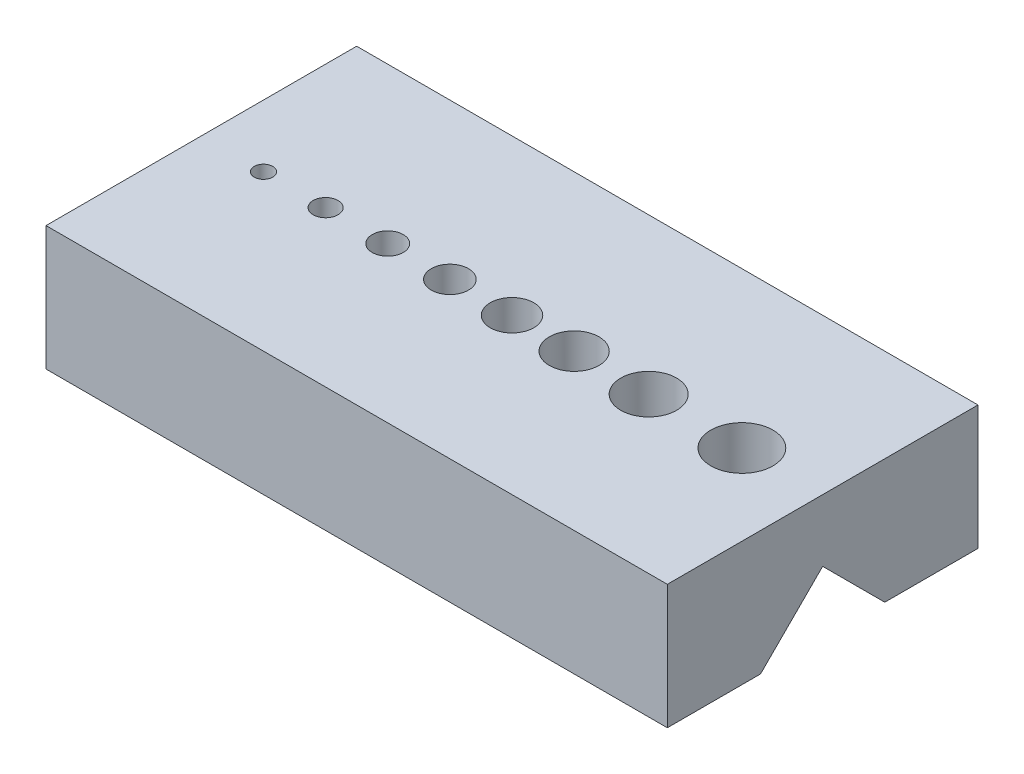
ISO-10303-21;
HEADER;
FILE_DESCRIPTION(('STEP AP214'),'2;1');
FILE_NAME('part.step','',(''),(''),'','','');
FILE_SCHEMA(('AUTOMOTIVE_DESIGN { 1 0 10303 214 1 1 1 1 }'));
ENDSEC;
DATA;
#1=APPLICATION_CONTEXT('core data for automotive mechanical design processes');
#2=APPLICATION_PROTOCOL_DEFINITION('international standard','automotive_design',2000,#1);
#3=PRODUCT_CONTEXT('',#1,'mechanical');
#4=PRODUCT('Part','Part','',(#3));
#5=PRODUCT_RELATED_PRODUCT_CATEGORY('part','',(#4));
#6=PRODUCT_DEFINITION_FORMATION('','',#4);
#7=PRODUCT_DEFINITION_CONTEXT('part definition',#1,'design');
#8=PRODUCT_DEFINITION('design','',#6,#7);
#9=PRODUCT_DEFINITION_SHAPE('','',#8);
#10=(LENGTH_UNIT() NAMED_UNIT(*) SI_UNIT(.MILLI.,.METRE.));
#11=(NAMED_UNIT(*) PLANE_ANGLE_UNIT() SI_UNIT($,.RADIAN.));
#12=(NAMED_UNIT(*) SI_UNIT($,.STERADIAN.) SOLID_ANGLE_UNIT());
#13=UNCERTAINTY_MEASURE_WITH_UNIT(LENGTH_MEASURE(1.E-05),#10,'distance_accuracy_value','');
#14=(GEOMETRIC_REPRESENTATION_CONTEXT(3) GLOBAL_UNCERTAINTY_ASSIGNED_CONTEXT((#13)) GLOBAL_UNIT_ASSIGNED_CONTEXT((#10,
#11,#12)) REPRESENTATION_CONTEXT('',''));
#15=CARTESIAN_POINT('',(0.,0.,0.));
#16=DIRECTION('',(0.,0.,1.));
#17=DIRECTION('',(1.,0.,0.));
#18=AXIS2_PLACEMENT_3D('',#15,#16,#17);
#19=CARTESIAN_POINT('',(0.,0.,0.));
#20=DIRECTION('',(0.,-1.,0.));
#21=DIRECTION('',(0.,0.,-1.));
#22=AXIS2_PLACEMENT_3D('',#19,#20,#21);
#23=PLANE('',#22);
#24=DIRECTION('',(1.,0.,0.));
#25=VECTOR('',#24,1.);
#26=CARTESIAN_POINT('',(0.,0.,-15.));
#27=LINE('',#26,#25);
#28=CARTESIAN_POINT('',(0.,0.,-15.));
#29=VERTEX_POINT('',#28);
#30=CARTESIAN_POINT('',(100.,0.,-15.));
#31=VERTEX_POINT('',#30);
#32=EDGE_CURVE('E304',#29,#31,#27,.T.);
#33=ORIENTED_EDGE('',*,*,#32,.T.);
#34=DIRECTION('',(0.,0.,-1.));
#35=VECTOR('',#34,1.);
#36=CARTESIAN_POINT('',(100.,0.,0.));
#37=LINE('',#36,#35);
#38=CARTESIAN_POINT('',(100.,0.,0.));
#39=VERTEX_POINT('',#38);
#40=EDGE_CURVE('E189',#39,#31,#37,.T.);
#41=ORIENTED_EDGE('',*,*,#40,.F.);
#42=DIRECTION('',(1.,0.,0.));
#43=VECTOR('',#42,1.);
#44=CARTESIAN_POINT('',(0.,0.,0.));
#45=LINE('',#44,#43);
#46=CARTESIAN_POINT('',(0.,0.,0.));
#47=VERTEX_POINT('',#46);
#48=EDGE_CURVE('E178',#47,#39,#45,.T.);
#49=ORIENTED_EDGE('',*,*,#48,.F.);
#50=DIRECTION('',(0.,0.,1.));
#51=VECTOR('',#50,1.);
#52=CARTESIAN_POINT('',(0.,0.,0.));
#53=LINE('',#52,#51);
#54=EDGE_CURVE('E179',#29,#47,#53,.T.);
#55=ORIENTED_EDGE('',*,*,#54,.F.);
#56=EDGE_LOOP('',(#33,#41,#49,#55));
#57=FACE_BOUND('',#56,.T.);
#58=ADVANCED_FACE('F45',(#57),#23,.T.);
#59=CARTESIAN_POINT('',(0.,20.,0.));
#60=DIRECTION('',(0.,-1.,0.));
#61=DIRECTION('',(0.,0.,-1.));
#62=AXIS2_PLACEMENT_3D('',#59,#60,#61);
#63=PLANE('',#62);
#64=DIRECTION('',(0.,0.,1.));
#65=VECTOR('',#64,1.);
#66=CARTESIAN_POINT('',(0.,20.,0.));
#67=LINE('',#66,#65);
#68=CARTESIAN_POINT('',(0.,20.,-50.));
#69=VERTEX_POINT('',#68);
#70=CARTESIAN_POINT('',(0.,20.,0.));
#71=VERTEX_POINT('',#70);
#72=EDGE_CURVE('E196',#69,#71,#67,.T.);
#73=ORIENTED_EDGE('',*,*,#72,.T.);
#74=DIRECTION('',(1.,0.,0.));
#75=VECTOR('',#74,1.);
#76=CARTESIAN_POINT('',(0.,20.,0.));
#77=LINE('',#76,#75);
#78=CARTESIAN_POINT('',(100.,20.,0.));
#79=VERTEX_POINT('',#78);
#80=EDGE_CURVE('E273',#71,#79,#77,.T.);
#81=ORIENTED_EDGE('',*,*,#80,.T.);
#82=DIRECTION('',(0.,0.,-1.));
#83=VECTOR('',#82,1.);
#84=CARTESIAN_POINT('',(100.,20.,0.));
#85=LINE('',#84,#83);
#86=CARTESIAN_POINT('',(100.,20.,-50.));
#87=VERTEX_POINT('',#86);
#88=EDGE_CURVE('E275',#79,#87,#85,.T.);
#89=ORIENTED_EDGE('',*,*,#88,.T.);
#90=DIRECTION('',(-1.,0.,0.));
#91=VECTOR('',#90,1.);
#92=CARTESIAN_POINT('',(0.,20.,-50.));
#93=LINE('',#92,#91);
#94=EDGE_CURVE('E186',#87,#69,#93,.T.);
#95=ORIENTED_EDGE('',*,*,#94,.T.);
#96=EDGE_LOOP('',(#73,#81,#89,#95));
#97=FACE_BOUND('',#96,.T.);
#98=CARTESIAN_POINT('',(10.,20.,-25.));
#99=DIRECTION('',(0.,1.,0.));
#100=DIRECTION('',(0.,0.,1.));
#101=AXIS2_PLACEMENT_3D('',#98,#99,#100);
#102=CIRCLE('',#101,1.5);
#103=CARTESIAN_POINT('',(10.,20.,-23.5));
#104=VERTEX_POINT('',#103);
#105=EDGE_CURVE('E184',#104,#104,#102,.T.);
#106=ORIENTED_EDGE('',*,*,#105,.F.);
#107=EDGE_LOOP('',(#106));
#108=FACE_BOUND('',#107,.T.);
#109=CARTESIAN_POINT('',(20.,20.,-25.));
#110=DIRECTION('',(0.,1.,0.));
#111=DIRECTION('',(0.,0.,1.));
#112=AXIS2_PLACEMENT_3D('',#109,#110,#111);
#113=CIRCLE('',#112,2.00000000000001);
#114=CARTESIAN_POINT('',(20.,20.,-23.));
#115=VERTEX_POINT('',#114);
#116=EDGE_CURVE('E263',#115,#115,#113,.T.);
#117=ORIENTED_EDGE('',*,*,#116,.F.);
#118=EDGE_LOOP('',(#117));
#119=FACE_BOUND('',#118,.T.);
#120=CARTESIAN_POINT('',(30.,20.,-25.));
#121=DIRECTION('',(0.,1.,0.));
#122=DIRECTION('',(0.,0.,1.));
#123=AXIS2_PLACEMENT_3D('',#120,#121,#122);
#124=CIRCLE('',#123,2.49999999999999);
#125=CARTESIAN_POINT('',(30.,20.,-22.5));
#126=VERTEX_POINT('',#125);
#127=EDGE_CURVE('E259',#126,#126,#124,.T.);
#128=ORIENTED_EDGE('',*,*,#127,.F.);
#129=EDGE_LOOP('',(#128));
#130=FACE_BOUND('',#129,.T.);
#131=CARTESIAN_POINT('',(40.,20.,-25.));
#132=DIRECTION('',(0.,1.,0.));
#133=DIRECTION('',(0.,0.,1.));
#134=AXIS2_PLACEMENT_3D('',#131,#132,#133);
#135=CIRCLE('',#134,3.);
#136=CARTESIAN_POINT('',(40.,20.,-22.));
#137=VERTEX_POINT('',#136);
#138=EDGE_CURVE('E255',#137,#137,#135,.T.);
#139=ORIENTED_EDGE('',*,*,#138,.F.);
#140=EDGE_LOOP('',(#139));
#141=FACE_BOUND('',#140,.T.);
#142=CARTESIAN_POINT('',(50.,20.,-25.));
#143=DIRECTION('',(0.,1.,0.));
#144=DIRECTION('',(0.,0.,1.));
#145=AXIS2_PLACEMENT_3D('',#142,#143,#144);
#146=CIRCLE('',#145,3.5);
#147=CARTESIAN_POINT('',(50.,20.,-21.5));
#148=VERTEX_POINT('',#147);
#149=EDGE_CURVE('E251',#148,#148,#146,.T.);
#150=ORIENTED_EDGE('',*,*,#149,.F.);
#151=EDGE_LOOP('',(#150));
#152=FACE_BOUND('',#151,.T.);
#153=CARTESIAN_POINT('',(60.,20.,-25.));
#154=DIRECTION('',(0.,1.,0.));
#155=DIRECTION('',(0.,0.,1.));
#156=AXIS2_PLACEMENT_3D('',#153,#154,#155);
#157=CIRCLE('',#156,4.00000000000001);
#158=CARTESIAN_POINT('',(60.,20.,-21.));
#159=VERTEX_POINT('',#158);
#160=EDGE_CURVE('E242',#159,#159,#157,.T.);
#161=ORIENTED_EDGE('',*,*,#160,.F.);
#162=EDGE_LOOP('',(#161));
#163=FACE_BOUND('',#162,.T.);
#164=CARTESIAN_POINT('',(72.,20.,-25.));
#165=DIRECTION('',(0.,1.,0.));
#166=DIRECTION('',(0.,0.,1.));
#167=AXIS2_PLACEMENT_3D('',#164,#165,#166);
#168=CIRCLE('',#167,4.5);
#169=CARTESIAN_POINT('',(72.,20.,-20.5));
#170=VERTEX_POINT('',#169);
#171=EDGE_CURVE('E236',#170,#170,#168,.T.);
#172=ORIENTED_EDGE('',*,*,#171,.F.);
#173=EDGE_LOOP('',(#172));
#174=FACE_BOUND('',#173,.T.);
#175=CARTESIAN_POINT('',(87.,20.,-25.));
#176=DIRECTION('',(0.,1.,0.));
#177=DIRECTION('',(0.,0.,1.));
#178=AXIS2_PLACEMENT_3D('',#175,#176,#177);
#179=CIRCLE('',#178,5.);
#180=CARTESIAN_POINT('',(87.,20.,-20.));
#181=VERTEX_POINT('',#180);
#182=EDGE_CURVE('E233',#181,#181,#179,.T.);
#183=ORIENTED_EDGE('',*,*,#182,.F.);
#184=EDGE_LOOP('',(#183));
#185=FACE_BOUND('',#184,.T.);
#186=ADVANCED_FACE('F282',(#97,#108,#119,#130,#141,#152,#163,#174,#185),#63,.F.);
#187=DIRECTION('',(1.,0.,0.));
#188=VECTOR('',#187,1.);
#189=CARTESIAN_POINT('',(0.,0.,-35.));
#190=LINE('',#189,#188);
#191=CARTESIAN_POINT('',(0.,0.,-35.));
#192=VERTEX_POINT('',#191);
#193=CARTESIAN_POINT('',(100.,0.,-35.));
#194=VERTEX_POINT('',#193);
#195=EDGE_CURVE('E61',#192,#194,#190,.T.);
#196=ORIENTED_EDGE('',*,*,#195,.F.);
#197=CARTESIAN_POINT('',(0.,0.,-50.));
#198=VERTEX_POINT('',#197);
#199=EDGE_CURVE('E168',#198,#192,#53,.T.);
#200=ORIENTED_EDGE('',*,*,#199,.F.);
#201=DIRECTION('',(-1.,0.,0.));
#202=VECTOR('',#201,1.);
#203=CARTESIAN_POINT('',(0.,0.,-50.));
#204=LINE('',#203,#202);
#205=CARTESIAN_POINT('',(100.,0.,-50.));
#206=VERTEX_POINT('',#205);
#207=EDGE_CURVE('E193',#206,#198,#204,.T.);
#208=ORIENTED_EDGE('',*,*,#207,.F.);
#209=EDGE_CURVE('E169',#194,#206,#37,.T.);
#210=ORIENTED_EDGE('',*,*,#209,.F.);
#211=EDGE_LOOP('',(#196,#200,#208,#210));
#212=FACE_BOUND('',#211,.T.);
#213=ADVANCED_FACE('F166',(#212),#23,.T.);
#214=CARTESIAN_POINT('',(0.,20.,0.));
#215=DIRECTION('',(1.,0.,0.));
#216=DIRECTION('',(0.,0.,-1.));
#217=AXIS2_PLACEMENT_3D('',#214,#215,#216);
#218=PLANE('',#217);
#219=DIRECTION('',(0.,0.707106781186548,0.707106781186547));
#220=VECTOR('',#219,1.);
#221=CARTESIAN_POINT('',(0.,10.,-25.));
#222=LINE('',#221,#220);
#223=CARTESIAN_POINT('',(0.,10.,-25.));
#224=VERTEX_POINT('',#223);
#225=EDGE_CURVE('E151',#192,#224,#222,.T.);
#226=ORIENTED_EDGE('',*,*,#225,.T.);
#227=DIRECTION('',(0.,-0.707106781186548,0.707106781186548));
#228=VECTOR('',#227,1.);
#229=CARTESIAN_POINT('',(0.,0.,-15.));
#230=LINE('',#229,#228);
#231=EDGE_CURVE('E160',#224,#29,#230,.T.);
#232=ORIENTED_EDGE('',*,*,#231,.T.);
#233=ORIENTED_EDGE('',*,*,#54,.T.);
#234=DIRECTION('',(0.,-1.,0.));
#235=VECTOR('',#234,1.);
#236=CARTESIAN_POINT('',(0.,20.,0.));
#237=LINE('',#236,#235);
#238=EDGE_CURVE('E207',#71,#47,#237,.T.);
#239=ORIENTED_EDGE('',*,*,#238,.F.);
#240=ORIENTED_EDGE('',*,*,#72,.F.);
#241=DIRECTION('',(0.,-1.,0.));
#242=VECTOR('',#241,1.);
#243=CARTESIAN_POINT('',(0.,20.,-50.));
#244=LINE('',#243,#242);
#245=EDGE_CURVE('E176',#69,#198,#244,.T.);
#246=ORIENTED_EDGE('',*,*,#245,.T.);
#247=ORIENTED_EDGE('',*,*,#199,.T.);
#248=EDGE_LOOP('',(#226,#232,#233,#239,#240,#246,#247));
#249=FACE_BOUND('',#248,.T.);
#250=ADVANCED_FACE('F47',(#249),#218,.F.);
#251=CARTESIAN_POINT('',(0.,20.,0.));
#252=DIRECTION('',(0.,0.,-1.));
#253=DIRECTION('',(-1.,0.,0.));
#254=AXIS2_PLACEMENT_3D('',#251,#252,#253);
#255=PLANE('',#254);
#256=ORIENTED_EDGE('',*,*,#48,.T.);
#257=DIRECTION('',(0.,-1.,0.));
#258=VECTOR('',#257,1.);
#259=CARTESIAN_POINT('',(100.,20.,0.));
#260=LINE('',#259,#258);
#261=EDGE_CURVE('E203',#79,#39,#260,.T.);
#262=ORIENTED_EDGE('',*,*,#261,.F.);
#263=ORIENTED_EDGE('',*,*,#80,.F.);
#264=ORIENTED_EDGE('',*,*,#238,.T.);
#265=EDGE_LOOP('',(#256,#262,#263,#264));
#266=FACE_BOUND('',#265,.T.);
#267=ADVANCED_FACE('F290',(#266),#255,.F.);
#268=CARTESIAN_POINT('',(100.,20.,0.));
#269=DIRECTION('',(-1.,0.,0.));
#270=DIRECTION('',(0.,0.,1.));
#271=AXIS2_PLACEMENT_3D('',#268,#269,#270);
#272=PLANE('',#271);
#273=ORIENTED_EDGE('',*,*,#40,.T.);
#274=DIRECTION('',(0.,-0.707106781186548,0.707106781186548));
#275=VECTOR('',#274,1.);
#276=CARTESIAN_POINT('',(100.,0.,-15.));
#277=LINE('',#276,#275);
#278=CARTESIAN_POINT('',(100.,10.,-25.));
#279=VERTEX_POINT('',#278);
#280=EDGE_CURVE('E161',#279,#31,#277,.T.);
#281=ORIENTED_EDGE('',*,*,#280,.F.);
#282=DIRECTION('',(0.,0.707106781186548,0.707106781186547));
#283=VECTOR('',#282,1.);
#284=CARTESIAN_POINT('',(100.,10.,-25.));
#285=LINE('',#284,#283);
#286=EDGE_CURVE('E296',#194,#279,#285,.T.);
#287=ORIENTED_EDGE('',*,*,#286,.F.);
#288=ORIENTED_EDGE('',*,*,#209,.T.);
#289=DIRECTION('',(0.,-1.,0.));
#290=VECTOR('',#289,1.);
#291=CARTESIAN_POINT('',(100.,20.,-50.));
#292=LINE('',#291,#290);
#293=EDGE_CURVE('E199',#87,#206,#292,.T.);
#294=ORIENTED_EDGE('',*,*,#293,.F.);
#295=ORIENTED_EDGE('',*,*,#88,.F.);
#296=ORIENTED_EDGE('',*,*,#261,.T.);
#297=EDGE_LOOP('',(#273,#281,#287,#288,#294,#295,#296));
#298=FACE_BOUND('',#297,.T.);
#299=ADVANCED_FACE('F294',(#298),#272,.F.);
#300=CARTESIAN_POINT('',(0.,20.,-50.));
#301=DIRECTION('',(0.,0.,1.));
#302=DIRECTION('',(1.,0.,0.));
#303=AXIS2_PLACEMENT_3D('',#300,#301,#302);
#304=PLANE('',#303);
#305=ORIENTED_EDGE('',*,*,#207,.T.);
#306=ORIENTED_EDGE('',*,*,#245,.F.);
#307=ORIENTED_EDGE('',*,*,#94,.F.);
#308=ORIENTED_EDGE('',*,*,#293,.T.);
#309=EDGE_LOOP('',(#305,#306,#307,#308));
#310=FACE_BOUND('',#309,.T.);
#311=ADVANCED_FACE('F286',(#310),#304,.F.);
#312=CARTESIAN_POINT('',(10.,20.,-25.));
#313=DIRECTION('',(0.,-1.,0.));
#314=DIRECTION('',(0.,0.,-1.));
#315=AXIS2_PLACEMENT_3D('',#312,#313,#314);
#316=CYLINDRICAL_SURFACE('',#315,1.5);
#317=CARTESIAN_POINT('',(10.,9.99999999999999,-25.));
#318=DIRECTION('',(0.,0.707106781186548,0.707106781186548));
#319=DIRECTION('',(0.,-0.707106781186548,0.707106781186548));
#320=AXIS2_PLACEMENT_3D('',#317,#318,#319);
#321=ELLIPSE('',#320,2.12132034355965,1.5);
#322=CARTESIAN_POINT('',(8.5,10.,-25.));
#323=VERTEX_POINT('',#322);
#324=CARTESIAN_POINT('',(11.5,10.,-25.));
#325=VERTEX_POINT('',#324);
#326=EDGE_CURVE('E237',#323,#325,#321,.T.);
#327=ORIENTED_EDGE('',*,*,#326,.F.);
#328=CARTESIAN_POINT('',(10.,10.,-25.));
#329=DIRECTION('',(0.,0.707106781186547,-0.707106781186548));
#330=DIRECTION('',(0.,-0.707106781186548,-0.707106781186547));
#331=AXIS2_PLACEMENT_3D('',#328,#329,#330);
#332=ELLIPSE('',#331,2.12132034355965,1.5);
#333=EDGE_CURVE('E327',#325,#323,#332,.T.);
#334=ORIENTED_EDGE('',*,*,#333,.F.);
#335=EDGE_LOOP('',(#327,#334));
#336=FACE_BOUND('',#335,.T.);
#337=ORIENTED_EDGE('',*,*,#105,.T.);
#338=EDGE_LOOP('',(#337));
#339=FACE_BOUND('',#338,.T.);
#340=ADVANCED_FACE('F391',(#336,#339),#316,.F.);
#341=CARTESIAN_POINT('',(20.,20.,-25.));
#342=DIRECTION('',(0.,-1.,0.));
#343=DIRECTION('',(0.,0.,-1.));
#344=AXIS2_PLACEMENT_3D('',#341,#342,#343);
#345=CYLINDRICAL_SURFACE('',#344,2.00000000000001);
#346=CARTESIAN_POINT('',(20.,9.99999999999999,-25.));
#347=DIRECTION('',(0.,0.707106781186548,0.707106781186548));
#348=DIRECTION('',(0.,-0.707106781186548,0.707106781186548));
#349=AXIS2_PLACEMENT_3D('',#346,#347,#348);
#350=ELLIPSE('',#349,2.8284271247462,2.00000000000001);
#351=CARTESIAN_POINT('',(18.,10.,-25.));
#352=VERTEX_POINT('',#351);
#353=CARTESIAN_POINT('',(22.,10.,-25.));
#354=VERTEX_POINT('',#353);
#355=EDGE_CURVE('E244',#352,#354,#350,.T.);
#356=ORIENTED_EDGE('',*,*,#355,.F.);
#357=CARTESIAN_POINT('',(20.,10.,-25.));
#358=DIRECTION('',(0.,0.707106781186547,-0.707106781186548));
#359=DIRECTION('',(0.,-0.707106781186548,-0.707106781186547));
#360=AXIS2_PLACEMENT_3D('',#357,#358,#359);
#361=ELLIPSE('',#360,2.8284271247462,2.00000000000001);
#362=EDGE_CURVE('E324',#354,#352,#361,.T.);
#363=ORIENTED_EDGE('',*,*,#362,.F.);
#364=EDGE_LOOP('',(#356,#363));
#365=FACE_BOUND('',#364,.T.);
#366=ORIENTED_EDGE('',*,*,#116,.T.);
#367=EDGE_LOOP('',(#366));
#368=FACE_BOUND('',#367,.T.);
#369=ADVANCED_FACE('F355',(#365,#368),#345,.F.);
#370=CARTESIAN_POINT('',(30.,20.,-25.));
#371=DIRECTION('',(0.,-1.,0.));
#372=DIRECTION('',(0.,0.,-1.));
#373=AXIS2_PLACEMENT_3D('',#370,#371,#372);
#374=CYLINDRICAL_SURFACE('',#373,2.49999999999999);
#375=CARTESIAN_POINT('',(30.,9.99999999999999,-25.));
#376=DIRECTION('',(0.,0.707106781186548,0.707106781186548));
#377=DIRECTION('',(0.,-0.707106781186548,0.707106781186548));
#378=AXIS2_PLACEMENT_3D('',#375,#376,#377);
#379=ELLIPSE('',#378,3.53553390593273,2.49999999999999);
#380=CARTESIAN_POINT('',(27.5,10.,-25.));
#381=VERTEX_POINT('',#380);
#382=CARTESIAN_POINT('',(32.5,10.,-25.));
#383=VERTEX_POINT('',#382);
#384=EDGE_CURVE('E344',#381,#383,#379,.T.);
#385=ORIENTED_EDGE('',*,*,#384,.F.);
#386=CARTESIAN_POINT('',(30.,10.,-25.));
#387=DIRECTION('',(0.,0.707106781186547,-0.707106781186548));
#388=DIRECTION('',(0.,-0.707106781186548,-0.707106781186547));
#389=AXIS2_PLACEMENT_3D('',#386,#387,#388);
#390=ELLIPSE('',#389,3.53553390593273,2.49999999999999);
#391=EDGE_CURVE('E321',#383,#381,#390,.T.);
#392=ORIENTED_EDGE('',*,*,#391,.F.);
#393=EDGE_LOOP('',(#385,#392));
#394=FACE_BOUND('',#393,.T.);
#395=ORIENTED_EDGE('',*,*,#127,.T.);
#396=EDGE_LOOP('',(#395));
#397=FACE_BOUND('',#396,.T.);
#398=ADVANCED_FACE('F424',(#394,#397),#374,.F.);
#399=CARTESIAN_POINT('',(40.,20.,-25.));
#400=DIRECTION('',(0.,-1.,0.));
#401=DIRECTION('',(0.,0.,-1.));
#402=AXIS2_PLACEMENT_3D('',#399,#400,#401);
#403=CYLINDRICAL_SURFACE('',#402,3.);
#404=CARTESIAN_POINT('',(40.,9.99999999999999,-25.));
#405=DIRECTION('',(0.,0.707106781186548,0.707106781186548));
#406=DIRECTION('',(0.,-0.707106781186548,0.707106781186548));
#407=AXIS2_PLACEMENT_3D('',#404,#405,#406);
#408=ELLIPSE('',#407,4.24264068711929,3.);
#409=CARTESIAN_POINT('',(37.,10.,-25.));
#410=VERTEX_POINT('',#409);
#411=CARTESIAN_POINT('',(43.,10.,-25.));
#412=VERTEX_POINT('',#411);
#413=EDGE_CURVE('E340',#410,#412,#408,.T.);
#414=ORIENTED_EDGE('',*,*,#413,.F.);
#415=CARTESIAN_POINT('',(40.,10.,-25.));
#416=DIRECTION('',(0.,0.707106781186547,-0.707106781186548));
#417=DIRECTION('',(0.,-0.707106781186548,-0.707106781186547));
#418=AXIS2_PLACEMENT_3D('',#415,#416,#417);
#419=ELLIPSE('',#418,4.24264068711929,3.);
#420=EDGE_CURVE('E318',#412,#410,#419,.T.);
#421=ORIENTED_EDGE('',*,*,#420,.F.);
#422=EDGE_LOOP('',(#414,#421));
#423=FACE_BOUND('',#422,.T.);
#424=ORIENTED_EDGE('',*,*,#138,.T.);
#425=EDGE_LOOP('',(#424));
#426=FACE_BOUND('',#425,.T.);
#427=ADVANCED_FACE('F431',(#423,#426),#403,.F.);
#428=CARTESIAN_POINT('',(50.,20.,-25.));
#429=DIRECTION('',(0.,-1.,0.));
#430=DIRECTION('',(0.,0.,-1.));
#431=AXIS2_PLACEMENT_3D('',#428,#429,#430);
#432=CYLINDRICAL_SURFACE('',#431,3.5);
#433=CARTESIAN_POINT('',(50.,9.99999999999999,-25.));
#434=DIRECTION('',(0.,0.707106781186548,0.707106781186548));
#435=DIRECTION('',(0.,-0.707106781186548,0.707106781186548));
#436=AXIS2_PLACEMENT_3D('',#433,#434,#435);
#437=ELLIPSE('',#436,4.94974746830583,3.5);
#438=CARTESIAN_POINT('',(46.5,10.,-25.));
#439=VERTEX_POINT('',#438);
#440=CARTESIAN_POINT('',(53.5,10.,-25.));
#441=VERTEX_POINT('',#440);
#442=EDGE_CURVE('E336',#439,#441,#437,.T.);
#443=ORIENTED_EDGE('',*,*,#442,.F.);
#444=CARTESIAN_POINT('',(50.,10.,-25.));
#445=DIRECTION('',(0.,0.707106781186547,-0.707106781186548));
#446=DIRECTION('',(0.,-0.707106781186548,-0.707106781186547));
#447=AXIS2_PLACEMENT_3D('',#444,#445,#446);
#448=ELLIPSE('',#447,4.94974746830584,3.5);
#449=EDGE_CURVE('E315',#441,#439,#448,.T.);
#450=ORIENTED_EDGE('',*,*,#449,.F.);
#451=EDGE_LOOP('',(#443,#450));
#452=FACE_BOUND('',#451,.T.);
#453=ORIENTED_EDGE('',*,*,#149,.T.);
#454=EDGE_LOOP('',(#453));
#455=FACE_BOUND('',#454,.T.);
#456=ADVANCED_FACE('F440',(#452,#455),#432,.F.);
#457=CARTESIAN_POINT('',(60.,20.,-25.));
#458=DIRECTION('',(0.,-1.,0.));
#459=DIRECTION('',(0.,0.,-1.));
#460=AXIS2_PLACEMENT_3D('',#457,#458,#459);
#461=CYLINDRICAL_SURFACE('',#460,4.00000000000001);
#462=CARTESIAN_POINT('',(60.,9.99999999999999,-25.));
#463=DIRECTION('',(0.,0.707106781186548,0.707106781186548));
#464=DIRECTION('',(0.,-0.707106781186548,0.707106781186548));
#465=AXIS2_PLACEMENT_3D('',#462,#463,#464);
#466=ELLIPSE('',#465,5.6568542494924,4.00000000000001);
#467=CARTESIAN_POINT('',(56.,10.,-25.));
#468=VERTEX_POINT('',#467);
#469=CARTESIAN_POINT('',(64.,10.,-25.));
#470=VERTEX_POINT('',#469);
#471=EDGE_CURVE('E332',#468,#470,#466,.T.);
#472=ORIENTED_EDGE('',*,*,#471,.F.);
#473=CARTESIAN_POINT('',(60.,10.,-25.));
#474=DIRECTION('',(0.,0.707106781186547,-0.707106781186548));
#475=DIRECTION('',(0.,-0.707106781186548,-0.707106781186547));
#476=AXIS2_PLACEMENT_3D('',#473,#474,#475);
#477=ELLIPSE('',#476,5.6568542494924,4.00000000000001);
#478=EDGE_CURVE('E312',#470,#468,#477,.T.);
#479=ORIENTED_EDGE('',*,*,#478,.F.);
#480=EDGE_LOOP('',(#472,#479));
#481=FACE_BOUND('',#480,.T.);
#482=ORIENTED_EDGE('',*,*,#160,.T.);
#483=EDGE_LOOP('',(#482));
#484=FACE_BOUND('',#483,.T.);
#485=ADVANCED_FACE('F377',(#481,#484),#461,.F.);
#486=CARTESIAN_POINT('',(72.,20.,-25.));
#487=DIRECTION('',(0.,-1.,0.));
#488=DIRECTION('',(0.,0.,-1.));
#489=AXIS2_PLACEMENT_3D('',#486,#487,#488);
#490=CYLINDRICAL_SURFACE('',#489,4.5);
#491=CARTESIAN_POINT('',(72.,9.99999999999999,-25.));
#492=DIRECTION('',(0.,0.707106781186548,0.707106781186548));
#493=DIRECTION('',(0.,-0.707106781186548,0.707106781186548));
#494=AXIS2_PLACEMENT_3D('',#491,#492,#493);
#495=ELLIPSE('',#494,6.36396103067893,4.5);
#496=CARTESIAN_POINT('',(67.5,10.,-25.));
#497=VERTEX_POINT('',#496);
#498=CARTESIAN_POINT('',(76.5,10.,-25.));
#499=VERTEX_POINT('',#498);
#500=EDGE_CURVE('E221',#497,#499,#495,.T.);
#501=ORIENTED_EDGE('',*,*,#500,.F.);
#502=CARTESIAN_POINT('',(72.,10.,-25.));
#503=DIRECTION('',(0.,0.707106781186547,-0.707106781186548));
#504=DIRECTION('',(0.,-0.707106781186548,-0.707106781186547));
#505=AXIS2_PLACEMENT_3D('',#502,#503,#504);
#506=ELLIPSE('',#505,6.36396103067894,4.5);
#507=EDGE_CURVE('E307',#499,#497,#506,.T.);
#508=ORIENTED_EDGE('',*,*,#507,.F.);
#509=EDGE_LOOP('',(#501,#508));
#510=FACE_BOUND('',#509,.T.);
#511=ORIENTED_EDGE('',*,*,#171,.T.);
#512=EDGE_LOOP('',(#511));
#513=FACE_BOUND('',#512,.T.);
#514=ADVANCED_FACE('F229',(#510,#513),#490,.F.);
#515=CARTESIAN_POINT('',(87.,20.,-25.));
#516=DIRECTION('',(0.,-1.,0.));
#517=DIRECTION('',(0.,0.,-1.));
#518=AXIS2_PLACEMENT_3D('',#515,#516,#517);
#519=CYLINDRICAL_SURFACE('',#518,5.);
#520=CARTESIAN_POINT('',(87.,9.99999999999999,-25.));
#521=DIRECTION('',(0.,0.707106781186548,0.707106781186548));
#522=DIRECTION('',(0.,-0.707106781186548,0.707106781186548));
#523=AXIS2_PLACEMENT_3D('',#520,#521,#522);
#524=ELLIPSE('',#523,7.07106781186548,5.);
#525=CARTESIAN_POINT('',(82.,10.,-25.));
#526=VERTEX_POINT('',#525);
#527=CARTESIAN_POINT('',(92.,10.,-25.));
#528=VERTEX_POINT('',#527);
#529=EDGE_CURVE('E11',#526,#528,#524,.T.);
#530=ORIENTED_EDGE('',*,*,#529,.F.);
#531=CARTESIAN_POINT('',(87.,10.,-25.));
#532=DIRECTION('',(0.,0.707106781186547,-0.707106781186548));
#533=DIRECTION('',(0.,-0.707106781186548,-0.707106781186547));
#534=AXIS2_PLACEMENT_3D('',#531,#532,#533);
#535=ELLIPSE('',#534,7.07106781186548,5.);
#536=EDGE_CURVE('E54',#528,#526,#535,.T.);
#537=ORIENTED_EDGE('',*,*,#536,.F.);
#538=EDGE_LOOP('',(#530,#537));
#539=FACE_BOUND('',#538,.T.);
#540=ORIENTED_EDGE('',*,*,#182,.T.);
#541=EDGE_LOOP('',(#540));
#542=FACE_BOUND('',#541,.T.);
#543=ADVANCED_FACE('F226',(#539,#542),#519,.F.);
#544=CARTESIAN_POINT('',(0.,0.,-15.));
#545=DIRECTION('',(0.,0.707106781186548,0.707106781186548));
#546=DIRECTION('',(0.,-0.707106781186548,0.707106781186548));
#547=AXIS2_PLACEMENT_3D('',#544,#545,#546);
#548=PLANE('',#547);
#549=ORIENTED_EDGE('',*,*,#326,.T.);
#550=DIRECTION('',(1.,0.,0.));
#551=VECTOR('',#550,1.);
#552=CARTESIAN_POINT('',(0.,10.,-25.));
#553=LINE('',#552,#551);
#554=EDGE_CURVE('E68',#325,#352,#553,.T.);
#555=ORIENTED_EDGE('',*,*,#554,.T.);
#556=ORIENTED_EDGE('',*,*,#355,.T.);
#557=EDGE_CURVE('E352',#354,#381,#553,.T.);
#558=ORIENTED_EDGE('',*,*,#557,.T.);
#559=ORIENTED_EDGE('',*,*,#384,.T.);
#560=EDGE_CURVE('E359',#383,#410,#553,.T.);
#561=ORIENTED_EDGE('',*,*,#560,.T.);
#562=ORIENTED_EDGE('',*,*,#413,.T.);
#563=EDGE_CURVE('E363',#412,#439,#553,.T.);
#564=ORIENTED_EDGE('',*,*,#563,.T.);
#565=ORIENTED_EDGE('',*,*,#442,.T.);
#566=EDGE_CURVE('E367',#441,#468,#553,.T.);
#567=ORIENTED_EDGE('',*,*,#566,.T.);
#568=ORIENTED_EDGE('',*,*,#471,.T.);
#569=EDGE_CURVE('E224',#470,#497,#553,.T.);
#570=ORIENTED_EDGE('',*,*,#569,.T.);
#571=ORIENTED_EDGE('',*,*,#500,.T.);
#572=EDGE_CURVE('E213',#499,#526,#553,.T.);
#573=ORIENTED_EDGE('',*,*,#572,.T.);
#574=ORIENTED_EDGE('',*,*,#529,.T.);
#575=EDGE_CURVE('E171',#528,#279,#553,.T.);
#576=ORIENTED_EDGE('',*,*,#575,.T.);
#577=ORIENTED_EDGE('',*,*,#280,.T.);
#578=ORIENTED_EDGE('',*,*,#32,.F.);
#579=ORIENTED_EDGE('',*,*,#231,.F.);
#580=EDGE_CURVE('E154',#224,#323,#553,.T.);
#581=ORIENTED_EDGE('',*,*,#580,.T.);
#582=EDGE_LOOP('',(#549,#555,#556,#558,#559,#561,#562,#564,#565,#567,#568,#570,#571,#573,#574,
#576,#577,#578,#579,#581));
#583=FACE_BOUND('',#582,.T.);
#584=ADVANCED_FACE('F218',(#583),#548,.F.);
#585=CARTESIAN_POINT('',(0.,10.,-25.));
#586=DIRECTION('',(0.,0.707106781186547,-0.707106781186548));
#587=DIRECTION('',(0.,0.707106781186548,0.707106781186547));
#588=AXIS2_PLACEMENT_3D('',#585,#586,#587);
#589=PLANE('',#588);
#590=ORIENTED_EDGE('',*,*,#333,.T.);
#591=ORIENTED_EDGE('',*,*,#580,.F.);
#592=ORIENTED_EDGE('',*,*,#225,.F.);
#593=ORIENTED_EDGE('',*,*,#195,.T.);
#594=ORIENTED_EDGE('',*,*,#286,.T.);
#595=ORIENTED_EDGE('',*,*,#575,.F.);
#596=ORIENTED_EDGE('',*,*,#536,.T.);
#597=ORIENTED_EDGE('',*,*,#572,.F.);
#598=ORIENTED_EDGE('',*,*,#507,.T.);
#599=ORIENTED_EDGE('',*,*,#569,.F.);
#600=ORIENTED_EDGE('',*,*,#478,.T.);
#601=ORIENTED_EDGE('',*,*,#566,.F.);
#602=ORIENTED_EDGE('',*,*,#449,.T.);
#603=ORIENTED_EDGE('',*,*,#563,.F.);
#604=ORIENTED_EDGE('',*,*,#420,.T.);
#605=ORIENTED_EDGE('',*,*,#560,.F.);
#606=ORIENTED_EDGE('',*,*,#391,.T.);
#607=ORIENTED_EDGE('',*,*,#557,.F.);
#608=ORIENTED_EDGE('',*,*,#362,.T.);
#609=ORIENTED_EDGE('',*,*,#554,.F.);
#610=EDGE_LOOP('',(#590,#591,#592,#593,#594,#595,#596,#597,#598,#599,#600,#601,#602,#603,#604,
#605,#606,#607,#608,#609));
#611=FACE_BOUND('',#610,.T.);
#612=ADVANCED_FACE('F152',(#611),#589,.F.);
#613=CLOSED_SHELL('',(#58,#186,#213,#250,#267,#299,#311,#340,#369,#398,#427,#456,#485,#514,#543,
#584,#612));
#614=MANIFOLD_SOLID_BREP('B2',#613);
#615=ADVANCED_BREP_SHAPE_REPRESENTATION('',(#18,#614),#14);
#616=SHAPE_DEFINITION_REPRESENTATION(#9,#615);
ENDSEC;
END-ISO-10303-21;
